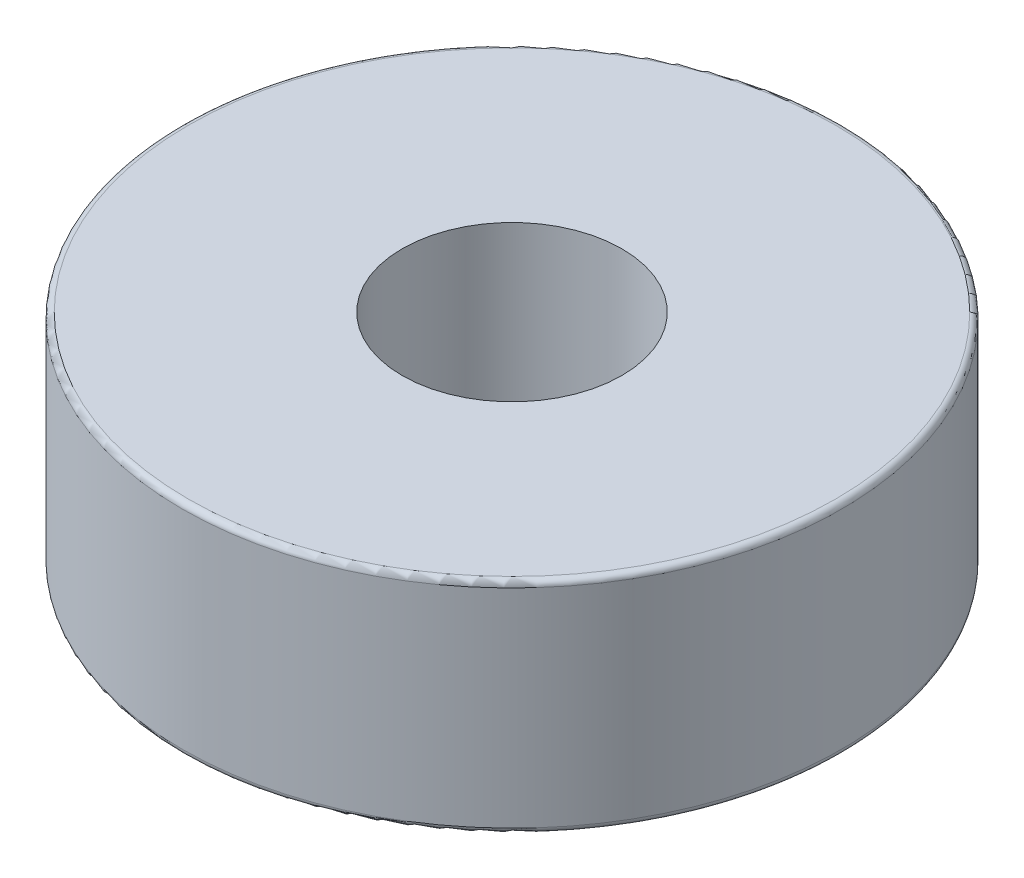
ISO-10303-21;
HEADER;
FILE_DESCRIPTION(('STEP AP214'),'2;1');
FILE_NAME('part.step','',(''),(''),'','','');
FILE_SCHEMA(('AUTOMOTIVE_DESIGN { 1 0 10303 214 1 1 1 1 }'));
ENDSEC;
DATA;
#1=APPLICATION_CONTEXT('core data for automotive mechanical design processes');
#2=APPLICATION_PROTOCOL_DEFINITION('international standard','automotive_design',2000,#1);
#3=PRODUCT_CONTEXT('',#1,'mechanical');
#4=PRODUCT('Part','Part','',(#3));
#5=PRODUCT_RELATED_PRODUCT_CATEGORY('part','',(#4));
#6=PRODUCT_DEFINITION_FORMATION('','',#4);
#7=PRODUCT_DEFINITION_CONTEXT('part definition',#1,'design');
#8=PRODUCT_DEFINITION('design','',#6,#7);
#9=PRODUCT_DEFINITION_SHAPE('','',#8);
#10=(LENGTH_UNIT() NAMED_UNIT(*) SI_UNIT(.MILLI.,.METRE.));
#11=(NAMED_UNIT(*) PLANE_ANGLE_UNIT() SI_UNIT($,.RADIAN.));
#12=(NAMED_UNIT(*) SI_UNIT($,.STERADIAN.) SOLID_ANGLE_UNIT());
#13=UNCERTAINTY_MEASURE_WITH_UNIT(LENGTH_MEASURE(1.E-05),#10,'distance_accuracy_value','');
#14=(GEOMETRIC_REPRESENTATION_CONTEXT(3) GLOBAL_UNCERTAINTY_ASSIGNED_CONTEXT((#13)) GLOBAL_UNIT_ASSIGNED_CONTEXT((#10,
#11,#12)) REPRESENTATION_CONTEXT('',''));
#15=CARTESIAN_POINT('',(0.,0.,0.));
#16=DIRECTION('',(0.,0.,1.));
#17=DIRECTION('',(1.,0.,0.));
#18=AXIS2_PLACEMENT_3D('',#15,#16,#17);
#19=CARTESIAN_POINT('',(0.,9.525,0.));
#20=DIRECTION('',(0.,-1.,0.));
#21=DIRECTION('',(0.,0.,-1.));
#22=AXIS2_PLACEMENT_3D('',#19,#20,#21);
#23=CYLINDRICAL_SURFACE('',#22,14.2875);
#24=CARTESIAN_POINT('',(0.,9.271,0.));
#25=DIRECTION('',(0.,1.,0.));
#26=DIRECTION('',(0.,0.,1.));
#27=AXIS2_PLACEMENT_3D('',#24,#25,#26);
#28=CIRCLE('',#27,14.2875);
#29=CARTESIAN_POINT('',(0.,9.271,-14.2875));
#30=VERTEX_POINT('',#29);
#31=EDGE_CURVE('E41',#30,#30,#28,.F.);
#32=CARTESIAN_POINT('',(0.,0.253999999999999,0.));
#33=DIRECTION('',(0.,1.,0.));
#34=DIRECTION('',(0.,0.,1.));
#35=AXIS2_PLACEMENT_3D('',#32,#33,#34);
#36=CIRCLE('',#35,14.2875);
#37=CARTESIAN_POINT('',(0.,0.253999999999997,-14.2875));
#38=VERTEX_POINT('',#37);
#39=EDGE_CURVE('E45',#38,#38,#36,.T.);
#40=CARTESIAN_POINT('',(0.,9.271,-14.2875));
#41=CARTESIAN_POINT('',(0.,9.17707291666667,-14.2875));
#42=CARTESIAN_POINT('',(0.,9.08314583333333,-14.2875));
#43=CARTESIAN_POINT('',(0.,8.89529166666667,-14.2875));
#44=CARTESIAN_POINT('',(0.,8.80136458333333,-14.2875));
#45=CARTESIAN_POINT('',(0.,8.61351041666667,-14.2875));
#46=CARTESIAN_POINT('',(0.,8.51958333333333,-14.2875));
#47=CARTESIAN_POINT('',(0.,8.33172916666667,-14.2875));
#48=CARTESIAN_POINT('',(0.,8.23780208333333,-14.2875));
#49=CARTESIAN_POINT('',(0.,8.04994791666667,-14.2875));
#50=CARTESIAN_POINT('',(0.,7.95602083333333,-14.2875));
#51=CARTESIAN_POINT('',(0.,7.76816666666667,-14.2875));
#52=CARTESIAN_POINT('',(0.,7.67423958333333,-14.2875));
#53=CARTESIAN_POINT('',(0.,7.48638541666667,-14.2875));
#54=CARTESIAN_POINT('',(0.,7.39245833333333,-14.2875));
#55=CARTESIAN_POINT('',(0.,7.20460416666667,-14.2875));
#56=CARTESIAN_POINT('',(0.,7.11067708333333,-14.2875));
#57=CARTESIAN_POINT('',(0.,6.92282291666667,-14.2875));
#58=CARTESIAN_POINT('',(0.,6.82889583333333,-14.2875));
#59=CARTESIAN_POINT('',(0.,6.64104166666667,-14.2875));
#60=CARTESIAN_POINT('',(0.,6.54711458333333,-14.2875));
#61=CARTESIAN_POINT('',(0.,6.35926041666667,-14.2875));
#62=CARTESIAN_POINT('',(0.,6.26533333333333,-14.2875));
#63=CARTESIAN_POINT('',(0.,6.07747916666667,-14.2875));
#64=CARTESIAN_POINT('',(0.,5.98355208333333,-14.2875));
#65=CARTESIAN_POINT('',(0.,5.79569791666667,-14.2875));
#66=CARTESIAN_POINT('',(0.,5.70177083333333,-14.2875));
#67=CARTESIAN_POINT('',(0.,5.51391666666667,-14.2875));
#68=CARTESIAN_POINT('',(0.,5.41998958333333,-14.2875));
#69=CARTESIAN_POINT('',(0.,5.23213541666667,-14.2875));
#70=CARTESIAN_POINT('',(0.,5.13820833333333,-14.2875));
#71=CARTESIAN_POINT('',(0.,4.95035416666667,-14.2875));
#72=CARTESIAN_POINT('',(0.,4.85642708333333,-14.2875));
#73=CARTESIAN_POINT('',(0.,4.66857291666667,-14.2875));
#74=CARTESIAN_POINT('',(0.,4.57464583333333,-14.2875));
#75=CARTESIAN_POINT('',(0.,4.38679166666667,-14.2875));
#76=CARTESIAN_POINT('',(0.,4.29286458333333,-14.2875));
#77=CARTESIAN_POINT('',(0.,4.10501041666667,-14.2875));
#78=CARTESIAN_POINT('',(0.,4.01108333333333,-14.2875));
#79=CARTESIAN_POINT('',(0.,3.82322916666667,-14.2875));
#80=CARTESIAN_POINT('',(0.,3.72930208333333,-14.2875));
#81=CARTESIAN_POINT('',(0.,3.54144791666667,-14.2875));
#82=CARTESIAN_POINT('',(0.,3.44752083333333,-14.2875));
#83=CARTESIAN_POINT('',(0.,3.25966666666667,-14.2875));
#84=CARTESIAN_POINT('',(0.,3.16573958333333,-14.2875));
#85=CARTESIAN_POINT('',(0.,2.97788541666666,-14.2875));
#86=CARTESIAN_POINT('',(0.,2.88395833333333,-14.2875));
#87=CARTESIAN_POINT('',(0.,2.69610416666666,-14.2875));
#88=CARTESIAN_POINT('',(0.,2.60217708333333,-14.2875));
#89=CARTESIAN_POINT('',(0.,2.41432291666667,-14.2875));
#90=CARTESIAN_POINT('',(0.,2.32039583333333,-14.2875));
#91=CARTESIAN_POINT('',(0.,2.13254166666666,-14.2875));
#92=CARTESIAN_POINT('',(0.,2.03861458333333,-14.2875));
#93=CARTESIAN_POINT('',(0.,1.85076041666667,-14.2875));
#94=CARTESIAN_POINT('',(0.,1.75683333333333,-14.2875));
#95=CARTESIAN_POINT('',(0.,1.56897916666666,-14.2875));
#96=CARTESIAN_POINT('',(0.,1.47505208333333,-14.2875));
#97=CARTESIAN_POINT('',(0.,1.28719791666666,-14.2875));
#98=CARTESIAN_POINT('',(0.,1.19327083333333,-14.2875));
#99=CARTESIAN_POINT('',(0.,1.00541666666666,-14.2875));
#100=CARTESIAN_POINT('',(0.,0.91148958333333,-14.2875));
#101=CARTESIAN_POINT('',(0.,0.723635416666664,-14.2875));
#102=CARTESIAN_POINT('',(0.,0.629708333333331,-14.2875));
#103=CARTESIAN_POINT('',(0.,0.441854166666664,-14.2875));
#104=CARTESIAN_POINT('',(0.,0.347927083333331,-14.2875));
#105=CARTESIAN_POINT('',(0.,0.253999999999997,-14.2875));
#106=B_SPLINE_CURVE_WITH_KNOTS('',3,(#40,#41,#42,#43,#44,#45,#46,#47,#48,#49,#50,#51,#52,#53,
#54,#55,#56,#57,#58,#59,#60,#61,#62,#63,#64,#65,#66,#67,#68,#69,#70,#71,#72,#73,#74,#75,#76,#77,
#78,#79,#80,#81,#82,#83,#84,#85,#86,#87,#88,#89,#90,#91,#92,#93,#94,#95,#96,#97,#98,#99,#100,
#101,#102,#103,#104,#105),.UNSPECIFIED.,.F.,.F.,(4,2,2,2,2,2,2,2,2,2,2,2,2,2,2,2,2,2,2,2,2,2,2,
2,2,2,2,2,2,2,2,2,4),(0.,0.28178125,0.5635625,0.84534375,1.127125,1.40890625,1.6906875,
1.97246875,2.25425,2.53603125,2.8178125,3.09959375,3.381375,3.66315625,3.9449375,4.22671875,
4.5085,4.79028125,5.0720625,5.35384375,5.635625,5.91740625,6.1991875,6.48096875,6.76275,
7.04453125,7.3263125,7.60809375,7.889875,8.17165625,8.4534375,8.73521875,9.017),.UNSPECIFIED.);
#107=EDGE_CURVE('BSEAM30',#30,#38,#106,.T.);
#108=ORIENTED_EDGE('',*,*,#31,.T.);
#109=ORIENTED_EDGE('',*,*,#39,.T.);
#110=ORIENTED_EDGE('',*,*,#107,.T.);
#111=ORIENTED_EDGE('',*,*,#107,.F.);
#112=EDGE_LOOP('',(#108,#110,#109,#111));
#113=FACE_BOUND('',#112,.T.);
#114=ADVANCED_FACE('F30',(#113),#23,.T.);
#115=CARTESIAN_POINT('',(0.,9.525,0.));
#116=DIRECTION('',(0.,1.,0.));
#117=DIRECTION('',(0.,0.,1.));
#118=AXIS2_PLACEMENT_3D('',#115,#116,#117);
#119=PLANE('',#118);
#120=CARTESIAN_POINT('',(0.,9.525,0.));
#121=DIRECTION('',(0.,1.,0.));
#122=DIRECTION('',(0.,0.,1.));
#123=AXIS2_PLACEMENT_3D('',#120,#121,#122);
#124=CIRCLE('',#123,14.0335);
#125=CARTESIAN_POINT('',(0.,9.525,14.0335));
#126=VERTEX_POINT('',#125);
#127=EDGE_CURVE('E37',#126,#126,#124,.T.);
#128=ORIENTED_EDGE('',*,*,#127,.T.);
#129=EDGE_LOOP('',(#128));
#130=FACE_BOUND('',#129,.T.);
#131=CARTESIAN_POINT('',(0.,9.525,0.));
#132=DIRECTION('',(0.,-1.,0.));
#133=DIRECTION('',(0.,0.,1.));
#134=AXIS2_PLACEMENT_3D('',#131,#132,#133);
#135=CIRCLE('',#134,4.7625);
#136=CARTESIAN_POINT('',(0.,9.525,-4.7625));
#137=VERTEX_POINT('',#136);
#138=EDGE_CURVE('E50',#137,#137,#135,.T.);
#139=ORIENTED_EDGE('',*,*,#138,.T.);
#140=EDGE_LOOP('',(#139));
#141=FACE_BOUND('',#140,.T.);
#142=ADVANCED_FACE('F57',(#130,#141),#119,.T.);
#143=CARTESIAN_POINT('',(0.,0.,0.));
#144=DIRECTION('',(0.,1.,0.));
#145=DIRECTION('',(0.,0.,1.));
#146=AXIS2_PLACEMENT_3D('',#143,#144,#145);
#147=PLANE('',#146);
#148=CARTESIAN_POINT('',(0.,0.,0.));
#149=DIRECTION('',(0.,1.,0.));
#150=DIRECTION('',(0.,0.,1.));
#151=AXIS2_PLACEMENT_3D('',#148,#149,#150);
#152=CIRCLE('',#151,14.0335);
#153=CARTESIAN_POINT('',(0.,0.,14.0335));
#154=VERTEX_POINT('',#153);
#155=EDGE_CURVE('E10',#154,#154,#152,.F.);
#156=ORIENTED_EDGE('',*,*,#155,.T.);
#157=EDGE_LOOP('',(#156));
#158=FACE_BOUND('',#157,.T.);
#159=CARTESIAN_POINT('',(0.,0.,0.));
#160=DIRECTION('',(0.,-1.,0.));
#161=DIRECTION('',(0.,0.,1.));
#162=AXIS2_PLACEMENT_3D('',#159,#160,#161);
#163=CIRCLE('',#162,4.7625);
#164=CARTESIAN_POINT('',(0.,0.,-4.7625));
#165=VERTEX_POINT('',#164);
#166=EDGE_CURVE('E51',#165,#165,#163,.T.);
#167=ORIENTED_EDGE('',*,*,#166,.F.);
#168=EDGE_LOOP('',(#167));
#169=FACE_BOUND('',#168,.T.);
#170=ADVANCED_FACE('F63',(#158,#169),#147,.F.);
#171=CARTESIAN_POINT('',(0.,9.525,0.));
#172=DIRECTION('',(0.,-1.,0.));
#173=DIRECTION('',(0.,0.,-1.));
#174=AXIS2_PLACEMENT_3D('',#171,#172,#173);
#175=CYLINDRICAL_SURFACE('',#174,4.7625);
#176=CARTESIAN_POINT('',(0.,9.525,-4.7625));
#177=CARTESIAN_POINT('',(0.,9.42578125,-4.7625));
#178=CARTESIAN_POINT('',(0.,9.3265625,-4.7625));
#179=CARTESIAN_POINT('',(0.,9.128125,-4.7625));
#180=CARTESIAN_POINT('',(0.,9.02890625,-4.7625));
#181=CARTESIAN_POINT('',(0.,8.83046875,-4.7625));
#182=CARTESIAN_POINT('',(0.,8.73125,-4.7625));
#183=CARTESIAN_POINT('',(0.,8.5328125,-4.7625));
#184=CARTESIAN_POINT('',(0.,8.43359375,-4.7625));
#185=CARTESIAN_POINT('',(0.,8.23515625,-4.7625));
#186=CARTESIAN_POINT('',(0.,8.1359375,-4.7625));
#187=CARTESIAN_POINT('',(0.,7.9375,-4.7625));
#188=CARTESIAN_POINT('',(0.,7.83828125,-4.7625));
#189=CARTESIAN_POINT('',(0.,7.63984375,-4.7625));
#190=CARTESIAN_POINT('',(0.,7.540625,-4.7625));
#191=CARTESIAN_POINT('',(0.,7.3421875,-4.7625));
#192=CARTESIAN_POINT('',(0.,7.24296875,-4.7625));
#193=CARTESIAN_POINT('',(0.,7.04453125,-4.7625));
#194=CARTESIAN_POINT('',(0.,6.9453125,-4.7625));
#195=CARTESIAN_POINT('',(0.,6.746875,-4.7625));
#196=CARTESIAN_POINT('',(0.,6.64765625,-4.7625));
#197=CARTESIAN_POINT('',(0.,6.44921875,-4.7625));
#198=CARTESIAN_POINT('',(0.,6.35,-4.7625));
#199=CARTESIAN_POINT('',(0.,6.1515625,-4.7625));
#200=CARTESIAN_POINT('',(0.,6.05234375,-4.7625));
#201=CARTESIAN_POINT('',(0.,5.85390625,-4.7625));
#202=CARTESIAN_POINT('',(0.,5.7546875,-4.7625));
#203=CARTESIAN_POINT('',(0.,5.55625,-4.7625));
#204=CARTESIAN_POINT('',(0.,5.45703125,-4.7625));
#205=CARTESIAN_POINT('',(0.,5.25859375,-4.7625));
#206=CARTESIAN_POINT('',(0.,5.159375,-4.7625));
#207=CARTESIAN_POINT('',(0.,4.9609375,-4.7625));
#208=CARTESIAN_POINT('',(0.,4.86171875,-4.7625));
#209=CARTESIAN_POINT('',(0.,4.66328125,-4.7625));
#210=CARTESIAN_POINT('',(0.,4.5640625,-4.7625));
#211=CARTESIAN_POINT('',(0.,4.365625,-4.7625));
#212=CARTESIAN_POINT('',(0.,4.26640625,-4.7625));
#213=CARTESIAN_POINT('',(0.,4.06796875,-4.7625));
#214=CARTESIAN_POINT('',(0.,3.96875,-4.7625));
#215=CARTESIAN_POINT('',(0.,3.7703125,-4.7625));
#216=CARTESIAN_POINT('',(0.,3.67109375,-4.7625));
#217=CARTESIAN_POINT('',(0.,3.47265625,-4.7625));
#218=CARTESIAN_POINT('',(0.,3.3734375,-4.7625));
#219=CARTESIAN_POINT('',(0.,3.175,-4.7625));
#220=CARTESIAN_POINT('',(0.,3.07578125,-4.7625));
#221=CARTESIAN_POINT('',(0.,2.87734375,-4.7625));
#222=CARTESIAN_POINT('',(0.,2.778125,-4.7625));
#223=CARTESIAN_POINT('',(0.,2.5796875,-4.7625));
#224=CARTESIAN_POINT('',(0.,2.48046875,-4.7625));
#225=CARTESIAN_POINT('',(0.,2.28203125,-4.7625));
#226=CARTESIAN_POINT('',(0.,2.1828125,-4.7625));
#227=CARTESIAN_POINT('',(0.,1.984375,-4.7625));
#228=CARTESIAN_POINT('',(0.,1.88515625,-4.7625));
#229=CARTESIAN_POINT('',(0.,1.68671875,-4.7625));
#230=CARTESIAN_POINT('',(0.,1.5875,-4.7625));
#231=CARTESIAN_POINT('',(0.,1.3890625,-4.7625));
#232=CARTESIAN_POINT('',(0.,1.28984375,-4.7625));
#233=CARTESIAN_POINT('',(0.,1.09140625,-4.7625));
#234=CARTESIAN_POINT('',(0.,0.992187500000001,-4.7625));
#235=CARTESIAN_POINT('',(0.,0.793750000000001,-4.7625));
#236=CARTESIAN_POINT('',(0.,0.69453125,-4.7625));
#237=CARTESIAN_POINT('',(0.,0.49609375,-4.7625));
#238=CARTESIAN_POINT('',(0.,0.396875,-4.7625));
#239=CARTESIAN_POINT('',(0.,0.1984375,-4.7625));
#240=CARTESIAN_POINT('',(0.,0.0992187500000001,-4.7625));
#241=CARTESIAN_POINT('',(0.,0.,-4.7625));
#242=B_SPLINE_CURVE_WITH_KNOTS('',3,(#176,#177,#178,#179,#180,#181,#182,#183,#184,#185,#186,
#187,#188,#189,#190,#191,#192,#193,#194,#195,#196,#197,#198,#199,#200,#201,#202,#203,#204,#205,
#206,#207,#208,#209,#210,#211,#212,#213,#214,#215,#216,#217,#218,#219,#220,#221,#222,#223,#224,
#225,#226,#227,#228,#229,#230,#231,#232,#233,#234,#235,#236,#237,#238,#239,#240,#241),
.UNSPECIFIED.,.F.,.F.,(4,2,2,2,2,2,2,2,2,2,2,2,2,2,2,2,2,2,2,2,2,2,2,2,2,2,2,2,2,2,2,2,4),(0.,
0.297656249999998,0.595312499999999,0.892968749999999,1.190625,1.48828125,1.7859375,2.08359375,
2.38125,2.67890625,2.9765625,3.27421875,3.571875,3.86953125,4.1671875,4.46484375,4.7625,
5.06015625,5.3578125,5.65546875,5.953125,6.25078125,6.5484375,6.84609375,7.14375,7.44140625,
7.7390625,8.03671875,8.334375,8.63203125,8.9296875,9.22734375,9.525),.UNSPECIFIED.);
#243=EDGE_CURVE('BSEAM59',#137,#165,#242,.T.);
#244=ORIENTED_EDGE('',*,*,#138,.F.);
#245=ORIENTED_EDGE('',*,*,#166,.T.);
#246=ORIENTED_EDGE('',*,*,#243,.T.);
#247=ORIENTED_EDGE('',*,*,#243,.F.);
#248=EDGE_LOOP('',(#244,#246,#245,#247));
#249=FACE_BOUND('',#248,.T.);
#250=ADVANCED_FACE('F59',(#249),#175,.F.);
#251=CARTESIAN_POINT('',(0.,9.271,0.));
#252=DIRECTION('',(0.,1.,0.));
#253=DIRECTION('',(0.,0.,1.));
#254=AXIS2_PLACEMENT_3D('',#251,#252,#253);
#255=TOROIDAL_SURFACE('',#254,14.0335,0.254);
#256=ORIENTED_EDGE('',*,*,#127,.F.);
#257=EDGE_LOOP('',(#256));
#258=FACE_BOUND('',#257,.T.);
#259=ORIENTED_EDGE('',*,*,#31,.F.);
#260=EDGE_LOOP('',(#259));
#261=FACE_BOUND('',#260,.T.);
#262=ADVANCED_FACE('F62',(#258,#261),#255,.T.);
#263=CARTESIAN_POINT('',(0.,0.253999999999999,0.));
#264=DIRECTION('',(0.,1.,0.));
#265=DIRECTION('',(0.,0.,1.));
#266=AXIS2_PLACEMENT_3D('',#263,#264,#265);
#267=TOROIDAL_SURFACE('',#266,14.0335,0.254);
#268=ORIENTED_EDGE('',*,*,#39,.F.);
#269=EDGE_LOOP('',(#268));
#270=FACE_BOUND('',#269,.T.);
#271=ORIENTED_EDGE('',*,*,#155,.F.);
#272=EDGE_LOOP('',(#271));
#273=FACE_BOUND('',#272,.T.);
#274=ADVANCED_FACE('F32',(#270,#273),#267,.T.);
#275=CLOSED_SHELL('',(#114,#142,#170,#250,#262,#274));
#276=MANIFOLD_SOLID_BREP('B2',#275);
#277=ADVANCED_BREP_SHAPE_REPRESENTATION('',(#18,#276),#14);
#278=SHAPE_DEFINITION_REPRESENTATION(#9,#277);
ENDSEC;
END-ISO-10303-21;
